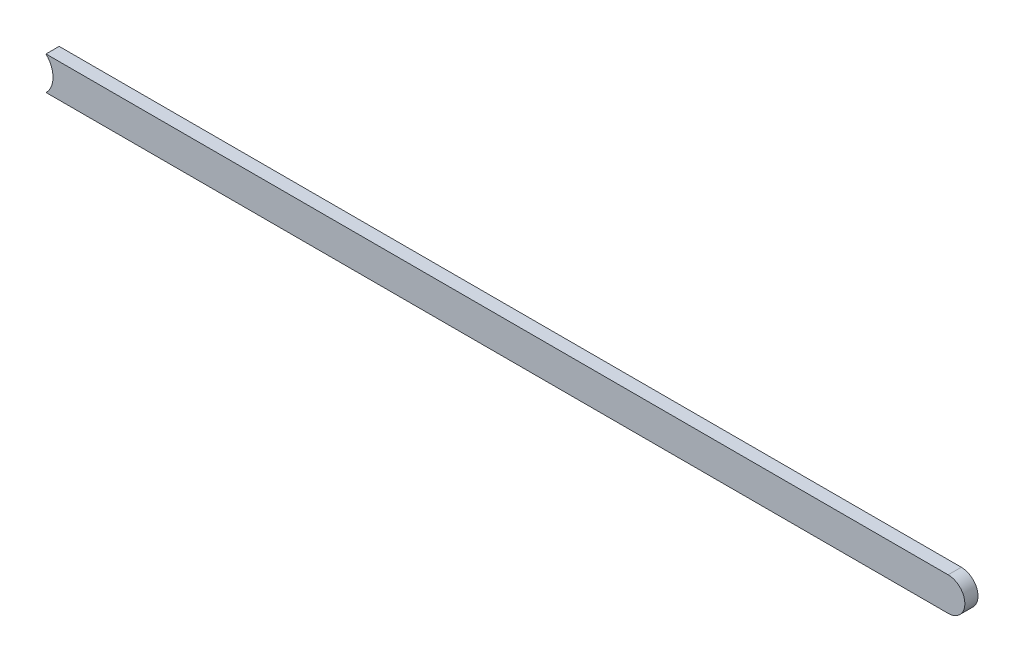
ISO-10303-21;
HEADER;
FILE_DESCRIPTION(('STEP AP214'),'2;1');
FILE_NAME('part.step','',(''),(''),'','','');
FILE_SCHEMA(('AUTOMOTIVE_DESIGN { 1 0 10303 214 1 1 1 1 }'));
ENDSEC;
DATA;
#1=APPLICATION_CONTEXT('core data for automotive mechanical design processes');
#2=APPLICATION_PROTOCOL_DEFINITION('international standard','automotive_design',2000,#1);
#3=PRODUCT_CONTEXT('',#1,'mechanical');
#4=PRODUCT('Part','Part','',(#3));
#5=PRODUCT_RELATED_PRODUCT_CATEGORY('part','',(#4));
#6=PRODUCT_DEFINITION_FORMATION('','',#4);
#7=PRODUCT_DEFINITION_CONTEXT('part definition',#1,'design');
#8=PRODUCT_DEFINITION('design','',#6,#7);
#9=PRODUCT_DEFINITION_SHAPE('','',#8);
#10=(LENGTH_UNIT() NAMED_UNIT(*) SI_UNIT(.MILLI.,.METRE.));
#11=(NAMED_UNIT(*) PLANE_ANGLE_UNIT() SI_UNIT($,.RADIAN.));
#12=(NAMED_UNIT(*) SI_UNIT($,.STERADIAN.) SOLID_ANGLE_UNIT());
#13=UNCERTAINTY_MEASURE_WITH_UNIT(LENGTH_MEASURE(1.E-05),#10,'distance_accuracy_value','');
#14=(GEOMETRIC_REPRESENTATION_CONTEXT(3) GLOBAL_UNCERTAINTY_ASSIGNED_CONTEXT((#13)) GLOBAL_UNIT_ASSIGNED_CONTEXT((#10,
#11,#12)) REPRESENTATION_CONTEXT('',''));
#15=CARTESIAN_POINT('',(0.,0.,0.));
#16=DIRECTION('',(0.,0.,1.));
#17=DIRECTION('',(1.,0.,0.));
#18=AXIS2_PLACEMENT_3D('',#15,#16,#17);
#19=CARTESIAN_POINT('',(137.916868157867,122.555,0.));
#20=DIRECTION('',(0.,1.,0.));
#21=DIRECTION('',(1.,0.,0.));
#22=AXIS2_PLACEMENT_3D('',#19,#20,#21);
#23=PLANE('',#22);
#24=DIRECTION('',(1.,0.,0.));
#25=VECTOR('',#24,1.);
#26=CARTESIAN_POINT('',(137.668,122.555,0.1999996));
#27=LINE('',#26,#25);
#28=CARTESIAN_POINT('',(137.916868157867,122.555,0.1999996));
#29=VERTEX_POINT('',#28);
#30=CARTESIAN_POINT('',(151.638,122.555,0.1999996));
#31=VERTEX_POINT('',#30);
#32=EDGE_CURVE('E11',#29,#31,#27,.T.);
#33=ORIENTED_EDGE('',*,*,#32,.F.);
#34=DIRECTION('',(0.,0.,1.));
#35=VECTOR('',#34,1.);
#36=CARTESIAN_POINT('',(137.916868157867,122.555,0.));
#37=LINE('',#36,#35);
#38=CARTESIAN_POINT('',(137.916868157867,122.555,0.));
#39=VERTEX_POINT('',#38);
#40=EDGE_CURVE('E24',#39,#29,#37,.T.);
#41=ORIENTED_EDGE('',*,*,#40,.F.);
#42=DIRECTION('',(1.,0.,0.));
#43=VECTOR('',#42,1.);
#44=CARTESIAN_POINT('',(137.668,122.555,0.));
#45=LINE('',#44,#43);
#46=CARTESIAN_POINT('',(151.638,122.555,0.));
#47=VERTEX_POINT('',#46);
#48=EDGE_CURVE('E82',#39,#47,#45,.T.);
#49=ORIENTED_EDGE('',*,*,#48,.T.);
#50=DIRECTION('',(0.,0.,1.));
#51=VECTOR('',#50,1.);
#52=CARTESIAN_POINT('',(151.638,122.555,0.));
#53=LINE('',#52,#51);
#54=EDGE_CURVE('E37',#47,#31,#53,.T.);
#55=ORIENTED_EDGE('',*,*,#54,.T.);
#56=EDGE_LOOP('',(#33,#41,#49,#55));
#57=FACE_BOUND('',#56,.T.);
#58=ADVANCED_FACE('F17',(#57),#23,.F.);
#59=CARTESIAN_POINT('',(151.638,122.809,0.));
#60=DIRECTION('',(0.,0.,-1.));
#61=DIRECTION('',(1.11896493820486E-13,-1.,0.));
#62=AXIS2_PLACEMENT_3D('',#59,#60,#61);
#63=CYLINDRICAL_SURFACE('',#62,0.254000000000005);
#64=CARTESIAN_POINT('',(151.638,122.809,0.1999996));
#65=DIRECTION('',(0.,0.,1.));
#66=DIRECTION('',(1.11896493820486E-13,-1.,0.));
#67=AXIS2_PLACEMENT_3D('',#64,#65,#66);
#68=CIRCLE('',#67,0.254000000000005);
#69=CARTESIAN_POINT('',(151.638,123.063,0.1999996));
#70=VERTEX_POINT('',#69);
#71=EDGE_CURVE('E97',#31,#70,#68,.T.);
#72=ORIENTED_EDGE('',*,*,#71,.F.);
#73=ORIENTED_EDGE('',*,*,#54,.F.);
#74=CARTESIAN_POINT('',(151.638,122.809,0.));
#75=DIRECTION('',(0.,0.,1.));
#76=DIRECTION('',(1.11896493820486E-13,-1.,0.));
#77=AXIS2_PLACEMENT_3D('',#74,#75,#76);
#78=CIRCLE('',#77,0.254000000000005);
#79=CARTESIAN_POINT('',(151.638,123.063,0.));
#80=VERTEX_POINT('',#79);
#81=EDGE_CURVE('E94',#47,#80,#78,.T.);
#82=ORIENTED_EDGE('',*,*,#81,.T.);
#83=DIRECTION('',(0.,0.,1.));
#84=VECTOR('',#83,1.);
#85=CARTESIAN_POINT('',(151.638,123.063,0.));
#86=LINE('',#85,#84);
#87=EDGE_CURVE('E92',#80,#70,#86,.T.);
#88=ORIENTED_EDGE('',*,*,#87,.T.);
#89=EDGE_LOOP('',(#72,#73,#82,#88));
#90=FACE_BOUND('',#89,.T.);
#91=ADVANCED_FACE('F103',(#90),#63,.T.);
#92=CARTESIAN_POINT('',(151.638,123.063,0.));
#93=DIRECTION('',(0.,-1.,0.));
#94=DIRECTION('',(-1.,0.,0.));
#95=AXIS2_PLACEMENT_3D('',#92,#93,#94);
#96=PLANE('',#95);
#97=DIRECTION('',(-1.,0.,0.));
#98=VECTOR('',#97,1.);
#99=CARTESIAN_POINT('',(151.638,123.063,0.1999996));
#100=LINE('',#99,#98);
#101=CARTESIAN_POINT('',(137.916868157867,123.063,0.1999996));
#102=VERTEX_POINT('',#101);
#103=EDGE_CURVE('E89',#70,#102,#100,.T.);
#104=ORIENTED_EDGE('',*,*,#103,.F.);
#105=ORIENTED_EDGE('',*,*,#87,.F.);
#106=DIRECTION('',(-1.,0.,0.));
#107=VECTOR('',#106,1.);
#108=CARTESIAN_POINT('',(151.638,123.063,0.));
#109=LINE('',#108,#107);
#110=CARTESIAN_POINT('',(137.916868157867,123.063,0.));
#111=VERTEX_POINT('',#110);
#112=EDGE_CURVE('E87',#80,#111,#109,.T.);
#113=ORIENTED_EDGE('',*,*,#112,.T.);
#114=DIRECTION('',(0.,0.,1.));
#115=VECTOR('',#114,1.);
#116=CARTESIAN_POINT('',(137.916868157867,123.063,0.));
#117=LINE('',#116,#115);
#118=EDGE_CURVE('E69',#111,#102,#117,.T.);
#119=ORIENTED_EDGE('',*,*,#118,.T.);
#120=EDGE_LOOP('',(#104,#105,#113,#119));
#121=FACE_BOUND('',#120,.T.);
#122=ADVANCED_FACE('F108',(#121),#96,.F.);
#123=CARTESIAN_POINT('',(137.668,122.809,0.));
#124=DIRECTION('',(0.,0.,-1.));
#125=DIRECTION('',(1.,0.,0.));
#126=AXIS2_PLACEMENT_3D('',#123,#124,#125);
#127=CYLINDRICAL_SURFACE('',#126,0.3556);
#128=DIRECTION('',(0.,0.,1.));
#129=VECTOR('',#128,1.);
#130=CARTESIAN_POINT('',(138.0236,122.809,0.));
#131=LINE('',#130,#129);
#132=CARTESIAN_POINT('',(138.0236,122.809,0.));
#133=VERTEX_POINT('',#132);
#134=CARTESIAN_POINT('',(138.0236,122.809,0.1999996));
#135=VERTEX_POINT('',#134);
#136=EDGE_CURVE('E59',#133,#135,#131,.T.);
#137=ORIENTED_EDGE('',*,*,#136,.T.);
#138=CARTESIAN_POINT('',(137.668,122.809,0.1999996));
#139=DIRECTION('',(0.,0.,1.));
#140=DIRECTION('',(1.,0.,0.));
#141=AXIS2_PLACEMENT_3D('',#138,#139,#140);
#142=CIRCLE('',#141,0.3556);
#143=EDGE_CURVE('E70',#135,#102,#142,.T.);
#144=ORIENTED_EDGE('',*,*,#143,.T.);
#145=ORIENTED_EDGE('',*,*,#118,.F.);
#146=CARTESIAN_POINT('',(137.668,122.809,0.));
#147=DIRECTION('',(0.,0.,1.));
#148=DIRECTION('',(1.,0.,0.));
#149=AXIS2_PLACEMENT_3D('',#146,#147,#148);
#150=CIRCLE('',#149,0.3556);
#151=EDGE_CURVE('E73',#133,#111,#150,.T.);
#152=ORIENTED_EDGE('',*,*,#151,.F.);
#153=EDGE_LOOP('',(#137,#144,#145,#152));
#154=FACE_BOUND('',#153,.T.);
#155=ADVANCED_FACE('F74',(#154),#127,.F.);
#156=CARTESIAN_POINT('',(137.668,122.809,0.));
#157=DIRECTION('',(0.,0.,-1.));
#158=DIRECTION('',(1.,0.,0.));
#159=AXIS2_PLACEMENT_3D('',#156,#157,#158);
#160=CYLINDRICAL_SURFACE('',#159,0.3556);
#161=ORIENTED_EDGE('',*,*,#40,.T.);
#162=CARTESIAN_POINT('',(137.668,122.809,0.1999996));
#163=DIRECTION('',(0.,0.,1.));
#164=DIRECTION('',(1.,0.,0.));
#165=AXIS2_PLACEMENT_3D('',#162,#163,#164);
#166=CIRCLE('',#165,0.3556);
#167=EDGE_CURVE('E65',#29,#135,#166,.T.);
#168=ORIENTED_EDGE('',*,*,#167,.T.);
#169=ORIENTED_EDGE('',*,*,#136,.F.);
#170=EDGE_CURVE('E63',#39,#133,#150,.T.);
#171=ORIENTED_EDGE('',*,*,#170,.F.);
#172=EDGE_LOOP('',(#161,#168,#169,#171));
#173=FACE_BOUND('',#172,.T.);
#174=ADVANCED_FACE('F61',(#173),#160,.F.);
#175=CARTESIAN_POINT('',(137.668,122.555,0.));
#176=DIRECTION('',(0.,0.,-1.));
#177=DIRECTION('',(-1.,0.,0.));
#178=AXIS2_PLACEMENT_3D('',#175,#176,#177);
#179=PLANE('',#178);
#180=ORIENTED_EDGE('',*,*,#48,.F.);
#181=ORIENTED_EDGE('',*,*,#170,.T.);
#182=ORIENTED_EDGE('',*,*,#151,.T.);
#183=ORIENTED_EDGE('',*,*,#112,.F.);
#184=ORIENTED_EDGE('',*,*,#81,.F.);
#185=EDGE_LOOP('',(#180,#181,#182,#183,#184));
#186=FACE_BOUND('',#185,.T.);
#187=ADVANCED_FACE('F80',(#186),#179,.T.);
#188=CARTESIAN_POINT('',(137.668,122.555,0.1999996));
#189=DIRECTION('',(0.,0.,-1.));
#190=DIRECTION('',(-1.,0.,0.));
#191=AXIS2_PLACEMENT_3D('',#188,#189,#190);
#192=PLANE('',#191);
#193=ORIENTED_EDGE('',*,*,#167,.F.);
#194=ORIENTED_EDGE('',*,*,#32,.T.);
#195=ORIENTED_EDGE('',*,*,#71,.T.);
#196=ORIENTED_EDGE('',*,*,#103,.T.);
#197=ORIENTED_EDGE('',*,*,#143,.F.);
#198=EDGE_LOOP('',(#193,#194,#195,#196,#197));
#199=FACE_BOUND('',#198,.T.);
#200=ADVANCED_FACE('F106',(#199),#192,.F.);
#201=CLOSED_SHELL('',(#58,#91,#122,#155,#174,#187,#200));
#202=MANIFOLD_SOLID_BREP('B1',#201);
#203=ADVANCED_BREP_SHAPE_REPRESENTATION('',(#18,#202),#14);
#204=SHAPE_DEFINITION_REPRESENTATION(#9,#203);
ENDSEC;
END-ISO-10303-21;
